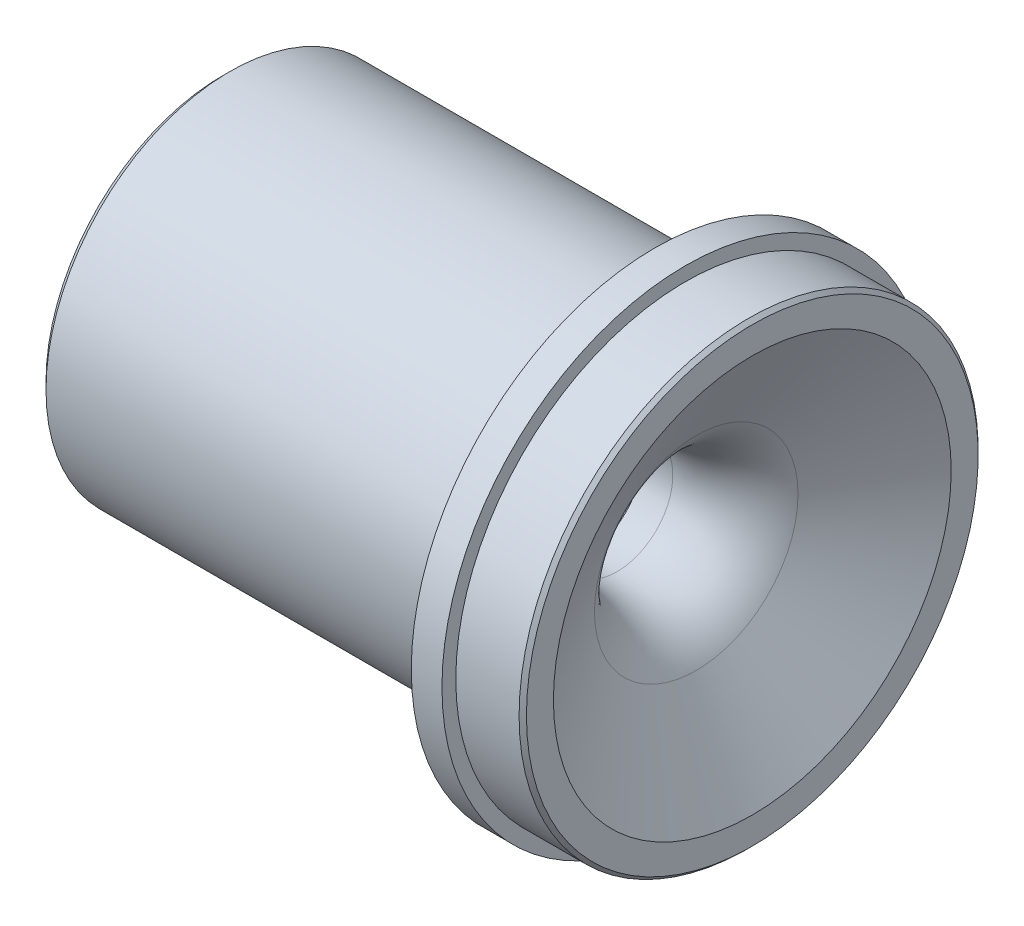
ISO-10303-21;
HEADER;
FILE_DESCRIPTION(('STEP AP214'),'2;1');
FILE_NAME('part.step','',(''),(''),'','','');
FILE_SCHEMA(('AUTOMOTIVE_DESIGN { 1 0 10303 214 1 1 1 1 }'));
ENDSEC;
DATA;
#1=APPLICATION_CONTEXT('core data for automotive mechanical design processes');
#2=APPLICATION_PROTOCOL_DEFINITION('international standard','automotive_design',2000,#1);
#3=PRODUCT_CONTEXT('',#1,'mechanical');
#4=PRODUCT('Part','Part','',(#3));
#5=PRODUCT_RELATED_PRODUCT_CATEGORY('part','',(#4));
#6=PRODUCT_DEFINITION_FORMATION('','',#4);
#7=PRODUCT_DEFINITION_CONTEXT('part definition',#1,'design');
#8=PRODUCT_DEFINITION('design','',#6,#7);
#9=PRODUCT_DEFINITION_SHAPE('','',#8);
#10=(LENGTH_UNIT() NAMED_UNIT(*) SI_UNIT(.MILLI.,.METRE.));
#11=(NAMED_UNIT(*) PLANE_ANGLE_UNIT() SI_UNIT($,.RADIAN.));
#12=(NAMED_UNIT(*) SI_UNIT($,.STERADIAN.) SOLID_ANGLE_UNIT());
#13=UNCERTAINTY_MEASURE_WITH_UNIT(LENGTH_MEASURE(1.E-05),#10,'distance_accuracy_value','');
#14=(GEOMETRIC_REPRESENTATION_CONTEXT(3) GLOBAL_UNCERTAINTY_ASSIGNED_CONTEXT((#13)) GLOBAL_UNIT_ASSIGNED_CONTEXT((#10,
#11,#12)) REPRESENTATION_CONTEXT('',''));
#15=CARTESIAN_POINT('',(0.,0.,0.));
#16=DIRECTION('',(0.,0.,1.));
#17=DIRECTION('',(1.,0.,0.));
#18=AXIS2_PLACEMENT_3D('',#15,#16,#17);
#19=CARTESIAN_POINT('',(-27.432,15.875,0.));
#20=DIRECTION('',(1.,0.,0.));
#21=DIRECTION('',(0.,0.,-1.));
#22=AXIS2_PLACEMENT_3D('',#19,#20,#21);
#23=PLANE('',#22);
#24=CARTESIAN_POINT('',(-27.432,0.,0.));
#25=DIRECTION('',(-1.,0.,0.));
#26=DIRECTION('',(0.,0.,1.));
#27=AXIS2_PLACEMENT_3D('',#24,#25,#26);
#28=CIRCLE('',#27,15.875);
#29=CARTESIAN_POINT('',(-27.432,0.,15.875));
#30=VERTEX_POINT('',#29);
#31=EDGE_CURVE('E10',#30,#30,#28,.T.);
#32=ORIENTED_EDGE('',*,*,#31,.F.);
#33=EDGE_LOOP('',(#32));
#34=FACE_BOUND('',#33,.T.);
#35=CARTESIAN_POINT('',(-27.432,0.,0.));
#36=DIRECTION('',(-1.,0.,0.));
#37=DIRECTION('',(0.,0.,1.));
#38=AXIS2_PLACEMENT_3D('',#35,#36,#37);
#39=CIRCLE('',#38,18.288);
#40=CARTESIAN_POINT('',(-27.432,0.,18.288));
#41=VERTEX_POINT('',#40);
#42=EDGE_CURVE('E110',#41,#41,#39,.T.);
#43=ORIENTED_EDGE('',*,*,#42,.T.);
#44=EDGE_LOOP('',(#43));
#45=FACE_BOUND('',#44,.T.);
#46=ADVANCED_FACE('F43',(#34,#45),#23,.F.);
#47=CARTESIAN_POINT('',(-27.432,0.,0.));
#48=DIRECTION('',(-1.,0.,0.));
#49=DIRECTION('',(0.,0.,1.));
#50=AXIS2_PLACEMENT_3D('',#47,#48,#49);
#51=CONICAL_SURFACE('',#50,15.875,0.26179938779915);
#52=CARTESIAN_POINT('',(10.2486509786191,0.,0.));
#53=DIRECTION('',(-1.,0.,0.));
#54=DIRECTION('',(0.,0.,1.));
#55=AXIS2_PLACEMENT_3D('',#52,#53,#54);
#56=CIRCLE('',#55,5.7785);
#57=CARTESIAN_POINT('',(10.2486509786191,0.,5.7785));
#58=VERTEX_POINT('',#57);
#59=EDGE_CURVE('E50',#58,#58,#56,.T.);
#60=ORIENTED_EDGE('',*,*,#59,.F.);
#61=EDGE_LOOP('',(#60));
#62=FACE_BOUND('',#61,.T.);
#63=ORIENTED_EDGE('',*,*,#31,.T.);
#64=EDGE_LOOP('',(#63));
#65=FACE_BOUND('',#64,.T.);
#66=ADVANCED_FACE('F196',(#62,#65),#51,.F.);
#67=CARTESIAN_POINT('',(-39.9173192759932,0.,0.));
#68=DIRECTION('',(-1.,0.,0.));
#69=DIRECTION('',(0.,0.,1.));
#70=AXIS2_PLACEMENT_3D('',#67,#68,#69);
#71=CYLINDRICAL_SURFACE('',#70,5.7785);
#72=CARTESIAN_POINT('',(13.4236509786191,0.,0.));
#73=DIRECTION('',(-1.,0.,0.));
#74=DIRECTION('',(0.,0.,1.));
#75=AXIS2_PLACEMENT_3D('',#72,#73,#74);
#76=CIRCLE('',#75,5.7785);
#77=CARTESIAN_POINT('',(13.4236509786191,0.,5.7785));
#78=VERTEX_POINT('',#77);
#79=EDGE_CURVE('E55',#78,#78,#76,.T.);
#80=ORIENTED_EDGE('',*,*,#79,.F.);
#81=EDGE_LOOP('',(#80));
#82=FACE_BOUND('',#81,.T.);
#83=ORIENTED_EDGE('',*,*,#59,.T.);
#84=EDGE_LOOP('',(#83));
#85=FACE_BOUND('',#84,.T.);
#86=ADVANCED_FACE('F191',(#82,#85),#71,.F.);
#87=CARTESIAN_POINT('',(13.3758187405864,0.,0.));
#88=DIRECTION('',(-1.,0.,0.));
#89=DIRECTION('',(0.,0.,1.));
#90=AXIS2_PLACEMENT_3D('',#87,#88,#89);
#91=TOROIDAL_SURFACE('',#90,15.3033798982982,9.525);
#92=CARTESIAN_POINT('',(21.6247107116331,0.,0.));
#93=DIRECTION('',(-1.,0.,0.));
#94=DIRECTION('',(0.,0.,1.));
#95=AXIS2_PLACEMENT_3D('',#92,#93,#94);
#96=CIRCLE('',#95,10.5408798982981);
#97=CARTESIAN_POINT('',(21.6247107116331,0.,10.5408798982981));
#98=VERTEX_POINT('',#97);
#99=EDGE_CURVE('E60',#98,#98,#96,.T.);
#100=ORIENTED_EDGE('',*,*,#99,.F.);
#101=EDGE_LOOP('',(#100));
#102=FACE_BOUND('',#101,.T.);
#103=ORIENTED_EDGE('',*,*,#79,.T.);
#104=EDGE_LOOP('',(#103));
#105=FACE_BOUND('',#104,.T.);
#106=ADVANCED_FACE('F185',(#102,#105),#91,.T.);
#107=CARTESIAN_POINT('',(21.6247107116331,0.,0.));
#108=DIRECTION('',(1.,0.,0.));
#109=DIRECTION('',(0.,0.,-1.));
#110=AXIS2_PLACEMENT_3D('',#107,#108,#109);
#111=CONICAL_SURFACE('',#110,10.5408798982981,1.04719755119659);
#112=CARTESIAN_POINT('',(27.432,0.,0.));
#113=DIRECTION('',(-1.,0.,0.));
#114=DIRECTION('',(0.,0.,1.));
#115=AXIS2_PLACEMENT_3D('',#112,#113,#114);
#116=CIRCLE('',#115,20.5994);
#117=CARTESIAN_POINT('',(27.432,0.,20.5994));
#118=VERTEX_POINT('',#117);
#119=EDGE_CURVE('E66',#118,#118,#116,.T.);
#120=ORIENTED_EDGE('',*,*,#119,.F.);
#121=EDGE_LOOP('',(#120));
#122=FACE_BOUND('',#121,.T.);
#123=ORIENTED_EDGE('',*,*,#99,.T.);
#124=EDGE_LOOP('',(#123));
#125=FACE_BOUND('',#124,.T.);
#126=ADVANCED_FACE('F179',(#122,#125),#111,.F.);
#127=CARTESIAN_POINT('',(27.432,23.3934,0.));
#128=DIRECTION('',(-1.,0.,0.));
#129=DIRECTION('',(0.,0.,1.));
#130=AXIS2_PLACEMENT_3D('',#127,#128,#129);
#131=PLANE('',#130);
#132=CARTESIAN_POINT('',(27.432,0.,0.));
#133=DIRECTION('',(-1.,0.,0.));
#134=DIRECTION('',(0.,0.,1.));
#135=AXIS2_PLACEMENT_3D('',#132,#133,#134);
#136=CIRCLE('',#135,23.3934);
#137=CARTESIAN_POINT('',(27.432,0.,23.3934));
#138=VERTEX_POINT('',#137);
#139=EDGE_CURVE('E70',#138,#138,#136,.T.);
#140=ORIENTED_EDGE('',*,*,#139,.F.);
#141=EDGE_LOOP('',(#140));
#142=FACE_BOUND('',#141,.T.);
#143=ORIENTED_EDGE('',*,*,#119,.T.);
#144=EDGE_LOOP('',(#143));
#145=FACE_BOUND('',#144,.T.);
#146=ADVANCED_FACE('F173',(#142,#145),#131,.F.);
#147=CARTESIAN_POINT('',(27.432,0.,0.));
#148=DIRECTION('',(-1.,0.,0.));
#149=DIRECTION('',(0.,0.,1.));
#150=AXIS2_PLACEMENT_3D('',#147,#148,#149);
#151=CONICAL_SURFACE('',#150,23.3934,0.785398163397439);
#152=CARTESIAN_POINT('',(27.051,0.,0.));
#153=DIRECTION('',(-1.,0.,0.));
#154=DIRECTION('',(0.,0.,1.));
#155=AXIS2_PLACEMENT_3D('',#152,#153,#154);
#156=CIRCLE('',#155,23.7744);
#157=CARTESIAN_POINT('',(27.051,0.,23.7744));
#158=VERTEX_POINT('',#157);
#159=EDGE_CURVE('E74',#158,#158,#156,.T.);
#160=ORIENTED_EDGE('',*,*,#159,.F.);
#161=EDGE_LOOP('',(#160));
#162=FACE_BOUND('',#161,.T.);
#163=ORIENTED_EDGE('',*,*,#139,.T.);
#164=EDGE_LOOP('',(#163));
#165=FACE_BOUND('',#164,.T.);
#166=ADVANCED_FACE('F167',(#162,#165),#151,.T.);
#167=CARTESIAN_POINT('',(-39.9173192759932,0.,0.));
#168=DIRECTION('',(-1.,0.,0.));
#169=DIRECTION('',(0.,0.,1.));
#170=AXIS2_PLACEMENT_3D('',#167,#168,#169);
#171=CYLINDRICAL_SURFACE('',#170,23.7744);
#172=CARTESIAN_POINT('',(20.4978,0.,0.));
#173=DIRECTION('',(-1.,0.,0.));
#174=DIRECTION('',(0.,0.,1.));
#175=AXIS2_PLACEMENT_3D('',#172,#173,#174);
#176=CIRCLE('',#175,23.7744);
#177=CARTESIAN_POINT('',(20.4978,0.,23.7744));
#178=VERTEX_POINT('',#177);
#179=EDGE_CURVE('E78',#178,#178,#176,.T.);
#180=ORIENTED_EDGE('',*,*,#179,.F.);
#181=EDGE_LOOP('',(#180));
#182=FACE_BOUND('',#181,.T.);
#183=ORIENTED_EDGE('',*,*,#159,.T.);
#184=EDGE_LOOP('',(#183));
#185=FACE_BOUND('',#184,.T.);
#186=ADVANCED_FACE('F161',(#182,#185),#171,.T.);
#187=CARTESIAN_POINT('',(20.4978,25.2095,0.));
#188=DIRECTION('',(-1.,0.,0.));
#189=DIRECTION('',(0.,0.,1.));
#190=AXIS2_PLACEMENT_3D('',#187,#188,#189);
#191=PLANE('',#190);
#192=CARTESIAN_POINT('',(20.4978,0.,0.));
#193=DIRECTION('',(-1.,0.,0.));
#194=DIRECTION('',(0.,0.,1.));
#195=AXIS2_PLACEMENT_3D('',#192,#193,#194);
#196=CIRCLE('',#195,25.2095);
#197=CARTESIAN_POINT('',(20.4978,0.,25.2095));
#198=VERTEX_POINT('',#197);
#199=EDGE_CURVE('E82',#198,#198,#196,.T.);
#200=ORIENTED_EDGE('',*,*,#199,.F.);
#201=EDGE_LOOP('',(#200));
#202=FACE_BOUND('',#201,.T.);
#203=ORIENTED_EDGE('',*,*,#179,.T.);
#204=EDGE_LOOP('',(#203));
#205=FACE_BOUND('',#204,.T.);
#206=ADVANCED_FACE('F155',(#202,#205),#191,.F.);
#207=CARTESIAN_POINT('',(-39.9173192759932,0.,0.));
#208=DIRECTION('',(-1.,0.,0.));
#209=DIRECTION('',(0.,0.,1.));
#210=AXIS2_PLACEMENT_3D('',#207,#208,#209);
#211=CYLINDRICAL_SURFACE('',#210,25.2095);
#212=CARTESIAN_POINT('',(17.3228,0.,0.));
#213=DIRECTION('',(-1.,0.,0.));
#214=DIRECTION('',(0.,0.,1.));
#215=AXIS2_PLACEMENT_3D('',#212,#213,#214);
#216=CIRCLE('',#215,25.2095);
#217=CARTESIAN_POINT('',(17.3228,0.,25.2095));
#218=VERTEX_POINT('',#217);
#219=EDGE_CURVE('E86',#218,#218,#216,.T.);
#220=ORIENTED_EDGE('',*,*,#219,.F.);
#221=EDGE_LOOP('',(#220));
#222=FACE_BOUND('',#221,.T.);
#223=ORIENTED_EDGE('',*,*,#199,.T.);
#224=EDGE_LOOP('',(#223));
#225=FACE_BOUND('',#224,.T.);
#226=ADVANCED_FACE('F149',(#222,#225),#211,.T.);
#227=CARTESIAN_POINT('',(17.3228,22.2123,0.));
#228=DIRECTION('',(1.,0.,0.));
#229=DIRECTION('',(0.,0.,-1.));
#230=AXIS2_PLACEMENT_3D('',#227,#228,#229);
#231=PLANE('',#230);
#232=CARTESIAN_POINT('',(17.3228,0.,0.));
#233=DIRECTION('',(-1.,0.,0.));
#234=DIRECTION('',(0.,0.,1.));
#235=AXIS2_PLACEMENT_3D('',#232,#233,#234);
#236=CIRCLE('',#235,22.2123);
#237=CARTESIAN_POINT('',(17.3228,0.,22.2123));
#238=VERTEX_POINT('',#237);
#239=EDGE_CURVE('E90',#238,#238,#236,.T.);
#240=ORIENTED_EDGE('',*,*,#239,.F.);
#241=EDGE_LOOP('',(#240));
#242=FACE_BOUND('',#241,.T.);
#243=ORIENTED_EDGE('',*,*,#219,.T.);
#244=EDGE_LOOP('',(#243));
#245=FACE_BOUND('',#244,.T.);
#246=ADVANCED_FACE('F143',(#242,#245),#231,.F.);
#247=CARTESIAN_POINT('',(-39.9173192759932,0.,0.));
#248=DIRECTION('',(-1.,0.,0.));
#249=DIRECTION('',(0.,0.,1.));
#250=AXIS2_PLACEMENT_3D('',#247,#248,#249);
#251=CYLINDRICAL_SURFACE('',#250,22.2123);
#252=CARTESIAN_POINT('',(15.5448,0.,0.));
#253=DIRECTION('',(-1.,0.,0.));
#254=DIRECTION('',(0.,0.,1.));
#255=AXIS2_PLACEMENT_3D('',#252,#253,#254);
#256=CIRCLE('',#255,22.2123);
#257=CARTESIAN_POINT('',(15.5448,0.,22.2123));
#258=VERTEX_POINT('',#257);
#259=EDGE_CURVE('E94',#258,#258,#256,.T.);
#260=ORIENTED_EDGE('',*,*,#259,.F.);
#261=EDGE_LOOP('',(#260));
#262=FACE_BOUND('',#261,.T.);
#263=ORIENTED_EDGE('',*,*,#239,.T.);
#264=EDGE_LOOP('',(#263));
#265=FACE_BOUND('',#264,.T.);
#266=ADVANCED_FACE('F137',(#262,#265),#251,.T.);
#267=CARTESIAN_POINT('',(15.5448,20.447,0.));
#268=DIRECTION('',(1.,0.,0.));
#269=DIRECTION('',(0.,0.,-1.));
#270=AXIS2_PLACEMENT_3D('',#267,#268,#269);
#271=PLANE('',#270);
#272=CARTESIAN_POINT('',(15.5448,0.,0.));
#273=DIRECTION('',(-1.,0.,0.));
#274=DIRECTION('',(0.,0.,1.));
#275=AXIS2_PLACEMENT_3D('',#272,#273,#274);
#276=CIRCLE('',#275,20.447);
#277=CARTESIAN_POINT('',(15.5448,0.,20.447));
#278=VERTEX_POINT('',#277);
#279=EDGE_CURVE('E98',#278,#278,#276,.T.);
#280=ORIENTED_EDGE('',*,*,#279,.F.);
#281=EDGE_LOOP('',(#280));
#282=FACE_BOUND('',#281,.T.);
#283=ORIENTED_EDGE('',*,*,#259,.T.);
#284=EDGE_LOOP('',(#283));
#285=FACE_BOUND('',#284,.T.);
#286=ADVANCED_FACE('F131',(#282,#285),#271,.F.);
#287=CARTESIAN_POINT('',(15.5448,0.,0.));
#288=DIRECTION('',(1.,0.,0.));
#289=DIRECTION('',(0.,0.,-1.));
#290=AXIS2_PLACEMENT_3D('',#287,#288,#289);
#291=CONICAL_SURFACE('',#290,20.447,0.78539816339745);
#292=CARTESIAN_POINT('',(14.1478,0.,0.));
#293=DIRECTION('',(-1.,0.,0.));
#294=DIRECTION('',(0.,0.,1.));
#295=AXIS2_PLACEMENT_3D('',#292,#293,#294);
#296=CIRCLE('',#295,19.05);
#297=CARTESIAN_POINT('',(14.1478,0.,19.05));
#298=VERTEX_POINT('',#297);
#299=EDGE_CURVE('E102',#298,#298,#296,.T.);
#300=ORIENTED_EDGE('',*,*,#299,.F.);
#301=EDGE_LOOP('',(#300));
#302=FACE_BOUND('',#301,.T.);
#303=ORIENTED_EDGE('',*,*,#279,.T.);
#304=EDGE_LOOP('',(#303));
#305=FACE_BOUND('',#304,.T.);
#306=ADVANCED_FACE('F125',(#302,#305),#291,.T.);
#307=CARTESIAN_POINT('',(-39.9173192759932,0.,0.));
#308=DIRECTION('',(-1.,0.,0.));
#309=DIRECTION('',(0.,0.,1.));
#310=AXIS2_PLACEMENT_3D('',#307,#308,#309);
#311=CYLINDRICAL_SURFACE('',#310,19.05);
#312=CARTESIAN_POINT('',(-26.67,0.,0.));
#313=DIRECTION('',(-1.,0.,0.));
#314=DIRECTION('',(0.,0.,1.));
#315=AXIS2_PLACEMENT_3D('',#312,#313,#314);
#316=CIRCLE('',#315,19.05);
#317=CARTESIAN_POINT('',(-26.67,0.,19.05));
#318=VERTEX_POINT('',#317);
#319=EDGE_CURVE('E106',#318,#318,#316,.T.);
#320=ORIENTED_EDGE('',*,*,#319,.F.);
#321=EDGE_LOOP('',(#320));
#322=FACE_BOUND('',#321,.T.);
#323=ORIENTED_EDGE('',*,*,#299,.T.);
#324=EDGE_LOOP('',(#323));
#325=FACE_BOUND('',#324,.T.);
#326=ADVANCED_FACE('F119',(#322,#325),#311,.T.);
#327=CARTESIAN_POINT('',(-26.67,0.,0.));
#328=DIRECTION('',(1.,0.,0.));
#329=DIRECTION('',(0.,0.,-1.));
#330=AXIS2_PLACEMENT_3D('',#327,#328,#329);
#331=CONICAL_SURFACE('',#330,19.05,0.785398163397448);
#332=ORIENTED_EDGE('',*,*,#42,.F.);
#333=EDGE_LOOP('',(#332));
#334=FACE_BOUND('',#333,.T.);
#335=ORIENTED_EDGE('',*,*,#319,.T.);
#336=EDGE_LOOP('',(#335));
#337=FACE_BOUND('',#336,.T.);
#338=ADVANCED_FACE('F116',(#334,#337),#331,.T.);
#339=CLOSED_SHELL('',(#46,#66,#86,#106,#126,#146,#166,#186,#206,#226,#246,#266,#286,#306,#326,#338));
#340=MANIFOLD_SOLID_BREP('B2',#339);
#341=ADVANCED_BREP_SHAPE_REPRESENTATION('',(#18,#340),#14);
#342=SHAPE_DEFINITION_REPRESENTATION(#9,#341);
ENDSEC;
END-ISO-10303-21;
